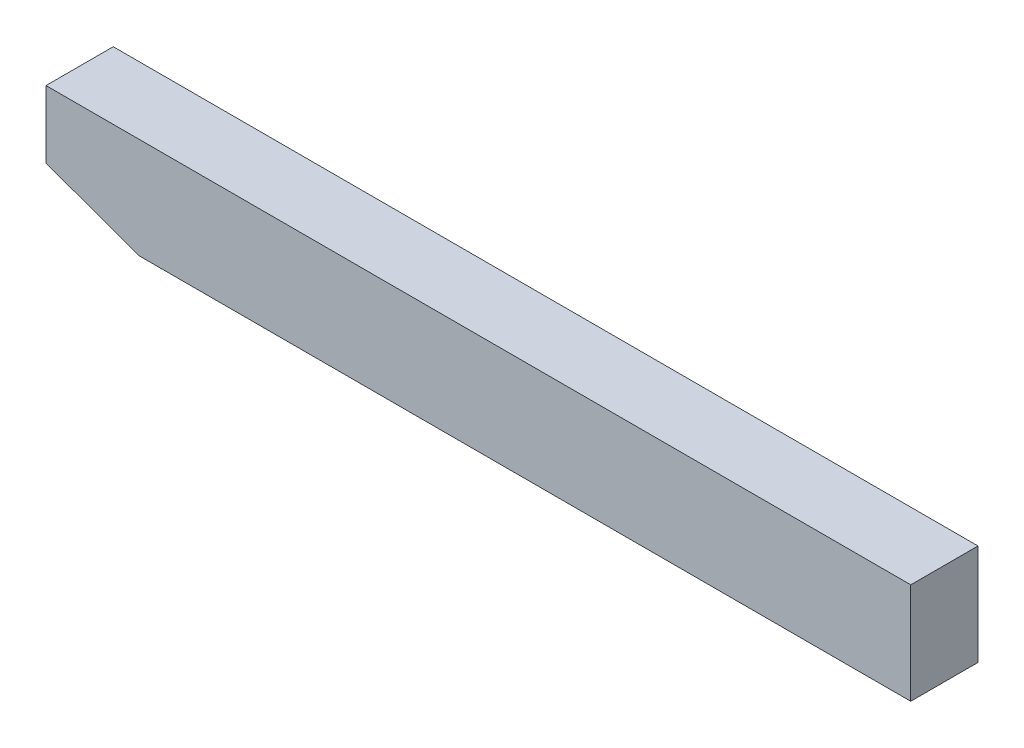
ISO-10303-21;
HEADER;
FILE_DESCRIPTION(('STEP AP214'),'2;1');
FILE_NAME('part.step','',(''),(''),'','','');
FILE_SCHEMA(('AUTOMOTIVE_DESIGN { 1 0 10303 214 1 1 1 1 }'));
ENDSEC;
DATA;
#1=APPLICATION_CONTEXT('core data for automotive mechanical design processes');
#2=APPLICATION_PROTOCOL_DEFINITION('international standard','automotive_design',2000,#1);
#3=PRODUCT_CONTEXT('',#1,'mechanical');
#4=PRODUCT('Part','Part','',(#3));
#5=PRODUCT_RELATED_PRODUCT_CATEGORY('part','',(#4));
#6=PRODUCT_DEFINITION_FORMATION('','',#4);
#7=PRODUCT_DEFINITION_CONTEXT('part definition',#1,'design');
#8=PRODUCT_DEFINITION('design','',#6,#7);
#9=PRODUCT_DEFINITION_SHAPE('','',#8);
#10=(LENGTH_UNIT() NAMED_UNIT(*) SI_UNIT(.MILLI.,.METRE.));
#11=(NAMED_UNIT(*) PLANE_ANGLE_UNIT() SI_UNIT($,.RADIAN.));
#12=(NAMED_UNIT(*) SI_UNIT($,.STERADIAN.) SOLID_ANGLE_UNIT());
#13=UNCERTAINTY_MEASURE_WITH_UNIT(LENGTH_MEASURE(1.E-05),#10,'distance_accuracy_value','');
#14=(GEOMETRIC_REPRESENTATION_CONTEXT(3) GLOBAL_UNCERTAINTY_ASSIGNED_CONTEXT((#13)) GLOBAL_UNIT_ASSIGNED_CONTEXT((#10,
#11,#12)) REPRESENTATION_CONTEXT('',''));
#15=CARTESIAN_POINT('',(0.,0.,0.));
#16=DIRECTION('',(0.,0.,1.));
#17=DIRECTION('',(1.,0.,0.));
#18=AXIS2_PLACEMENT_3D('',#15,#16,#17);
#19=CARTESIAN_POINT('',(326.5693928594,12.7,-12.7));
#20=DIRECTION('',(0.,0.,1.));
#21=DIRECTION('',(0.,-1.,0.));
#22=AXIS2_PLACEMENT_3D('',#19,#20,#21);
#23=PLANE('',#22);
#24=DIRECTION('',(-1.,0.,0.));
#25=VECTOR('',#24,1.);
#26=CARTESIAN_POINT('',(326.5693928594,-12.7,-12.7));
#27=LINE('',#26,#25);
#28=CARTESIAN_POINT('',(326.5693928594,-12.7,-12.7));
#29=VERTEX_POINT('',#28);
#30=CARTESIAN_POINT('',(35.2949340270433,-12.7,-12.7));
#31=VERTEX_POINT('',#30);
#32=EDGE_CURVE('E51',#29,#31,#27,.T.);
#33=ORIENTED_EDGE('',*,*,#32,.T.);
#34=DIRECTION('',(-0.940939875543587,0.338573700413986,0.));
#35=VECTOR('',#34,1.);
#36=CARTESIAN_POINT('',(0.,0.,-12.7));
#37=LINE('',#36,#35);
#38=CARTESIAN_POINT('',(0.,0.,-12.7));
#39=VERTEX_POINT('',#38);
#40=EDGE_CURVE('E122',#31,#39,#37,.T.);
#41=ORIENTED_EDGE('',*,*,#40,.T.);
#42=DIRECTION('',(0.,1.,0.));
#43=VECTOR('',#42,1.);
#44=CARTESIAN_POINT('',(0.,12.7,-12.7));
#45=LINE('',#44,#43);
#46=CARTESIAN_POINT('',(0.,25.4,-12.7));
#47=VERTEX_POINT('',#46);
#48=EDGE_CURVE('E136',#39,#47,#45,.T.);
#49=ORIENTED_EDGE('',*,*,#48,.T.);
#50=DIRECTION('',(1.,0.,0.));
#51=VECTOR('',#50,1.);
#52=CARTESIAN_POINT('',(326.5693928594,25.4,-12.7));
#53=LINE('',#52,#51);
#54=CARTESIAN_POINT('',(326.5693928594,25.4,-12.7));
#55=VERTEX_POINT('',#54);
#56=EDGE_CURVE('E118',#47,#55,#53,.T.);
#57=ORIENTED_EDGE('',*,*,#56,.T.);
#58=DIRECTION('',(0.,1.,0.));
#59=VECTOR('',#58,1.);
#60=CARTESIAN_POINT('',(326.5693928594,12.7,-12.7));
#61=LINE('',#60,#59);
#62=EDGE_CURVE('E97',#29,#55,#61,.T.);
#63=ORIENTED_EDGE('',*,*,#62,.F.);
#64=EDGE_LOOP('',(#33,#41,#49,#57,#63));
#65=FACE_BOUND('',#64,.T.);
#66=ADVANCED_FACE('F43',(#65),#23,.F.);
#67=CARTESIAN_POINT('',(326.5693928594,12.7,12.7));
#68=DIRECTION('',(0.,0.,-1.));
#69=DIRECTION('',(0.,1.,0.));
#70=AXIS2_PLACEMENT_3D('',#67,#68,#69);
#71=PLANE('',#70);
#72=DIRECTION('',(0.,-1.,0.));
#73=VECTOR('',#72,1.);
#74=CARTESIAN_POINT('',(0.,12.7,12.7));
#75=LINE('',#74,#73);
#76=CARTESIAN_POINT('',(0.,25.4,12.7));
#77=VERTEX_POINT('',#76);
#78=CARTESIAN_POINT('',(0.,0.,12.7));
#79=VERTEX_POINT('',#78);
#80=EDGE_CURVE('E140',#77,#79,#75,.T.);
#81=ORIENTED_EDGE('',*,*,#80,.T.);
#82=DIRECTION('',(0.940939875543587,-0.338573700413986,0.));
#83=VECTOR('',#82,1.);
#84=CARTESIAN_POINT('',(285.088106838636,-102.581830981084,12.7));
#85=LINE('',#84,#83);
#86=CARTESIAN_POINT('',(35.2949340270433,-12.7,12.7));
#87=VERTEX_POINT('',#86);
#88=EDGE_CURVE('E58',#79,#87,#85,.T.);
#89=ORIENTED_EDGE('',*,*,#88,.T.);
#90=DIRECTION('',(-1.,0.,0.));
#91=VECTOR('',#90,1.);
#92=CARTESIAN_POINT('',(326.5693928594,-12.7,12.7));
#93=LINE('',#92,#91);
#94=CARTESIAN_POINT('',(326.5693928594,-12.7,12.7));
#95=VERTEX_POINT('',#94);
#96=EDGE_CURVE('E11',#95,#87,#93,.T.);
#97=ORIENTED_EDGE('',*,*,#96,.F.);
#98=DIRECTION('',(0.,-1.,0.));
#99=VECTOR('',#98,1.);
#100=CARTESIAN_POINT('',(326.5693928594,12.7,12.7));
#101=LINE('',#100,#99);
#102=CARTESIAN_POINT('',(326.5693928594,25.4,12.7));
#103=VERTEX_POINT('',#102);
#104=EDGE_CURVE('E90',#103,#95,#101,.T.);
#105=ORIENTED_EDGE('',*,*,#104,.F.);
#106=DIRECTION('',(-1.,0.,0.));
#107=VECTOR('',#106,1.);
#108=CARTESIAN_POINT('',(326.5693928594,25.4,12.7));
#109=LINE('',#108,#107);
#110=EDGE_CURVE('E95',#103,#77,#109,.T.);
#111=ORIENTED_EDGE('',*,*,#110,.T.);
#112=EDGE_LOOP('',(#81,#89,#97,#105,#111));
#113=FACE_BOUND('',#112,.T.);
#114=ADVANCED_FACE('F93',(#113),#71,.F.);
#115=CARTESIAN_POINT('',(326.5693928594,-12.7,12.7));
#116=DIRECTION('',(0.,1.,0.));
#117=DIRECTION('',(0.,0.,1.));
#118=AXIS2_PLACEMENT_3D('',#115,#116,#117);
#119=PLANE('',#118);
#120=ORIENTED_EDGE('',*,*,#96,.T.);
#121=DIRECTION('',(0.,0.,1.));
#122=VECTOR('',#121,1.);
#123=CARTESIAN_POINT('',(35.2949340270433,-12.7,-12.7));
#124=LINE('',#123,#122);
#125=EDGE_CURVE('E126',#31,#87,#124,.T.);
#126=ORIENTED_EDGE('',*,*,#125,.F.);
#127=ORIENTED_EDGE('',*,*,#32,.F.);
#128=DIRECTION('',(0.,0.,-1.));
#129=VECTOR('',#128,1.);
#130=CARTESIAN_POINT('',(326.5693928594,-12.7,12.7));
#131=LINE('',#130,#129);
#132=EDGE_CURVE('E66',#95,#29,#131,.T.);
#133=ORIENTED_EDGE('',*,*,#132,.F.);
#134=EDGE_LOOP('',(#120,#126,#127,#133));
#135=FACE_BOUND('',#134,.T.);
#136=ADVANCED_FACE('F157',(#135),#119,.F.);
#137=CARTESIAN_POINT('',(326.5693928594,0.,0.));
#138=DIRECTION('',(1.,0.,0.));
#139=DIRECTION('',(0.,0.,-1.));
#140=AXIS2_PLACEMENT_3D('',#137,#138,#139);
#141=PLANE('',#140);
#142=ORIENTED_EDGE('',*,*,#62,.T.);
#143=DIRECTION('',(0.,0.,1.));
#144=VECTOR('',#143,1.);
#145=CARTESIAN_POINT('',(326.5693928594,25.4,-339.516245545654));
#146=LINE('',#145,#144);
#147=EDGE_CURVE('E100',#55,#103,#146,.T.);
#148=ORIENTED_EDGE('',*,*,#147,.T.);
#149=ORIENTED_EDGE('',*,*,#104,.T.);
#150=ORIENTED_EDGE('',*,*,#132,.T.);
#151=EDGE_LOOP('',(#142,#148,#149,#150));
#152=FACE_BOUND('',#151,.T.);
#153=ADVANCED_FACE('F101',(#152),#141,.T.);
#154=CARTESIAN_POINT('',(0.,0.,0.));
#155=DIRECTION('',(1.,0.,0.));
#156=DIRECTION('',(0.,0.,-1.));
#157=AXIS2_PLACEMENT_3D('',#154,#155,#156);
#158=PLANE('',#157);
#159=ORIENTED_EDGE('',*,*,#48,.F.);
#160=DIRECTION('',(0.,0.,1.));
#161=VECTOR('',#160,1.);
#162=CARTESIAN_POINT('',(0.,0.,-12.7));
#163=LINE('',#162,#161);
#164=EDGE_CURVE('E127',#39,#79,#163,.T.);
#165=ORIENTED_EDGE('',*,*,#164,.T.);
#166=ORIENTED_EDGE('',*,*,#80,.F.);
#167=DIRECTION('',(0.,0.,1.));
#168=VECTOR('',#167,1.);
#169=CARTESIAN_POINT('',(0.,25.4,-339.516245545654));
#170=LINE('',#169,#168);
#171=EDGE_CURVE('E107',#47,#77,#170,.T.);
#172=ORIENTED_EDGE('',*,*,#171,.F.);
#173=EDGE_LOOP('',(#159,#165,#166,#172));
#174=FACE_BOUND('',#173,.T.);
#175=ADVANCED_FACE('F160',(#174),#158,.F.);
#176=CARTESIAN_POINT('',(0.,0.,-12.7));
#177=DIRECTION('',(0.338573700413986,0.940939875543587,0.));
#178=DIRECTION('',(-0.940939875543587,0.338573700413986,0.));
#179=AXIS2_PLACEMENT_3D('',#176,#177,#178);
#180=PLANE('',#179);
#181=ORIENTED_EDGE('',*,*,#164,.F.);
#182=ORIENTED_EDGE('',*,*,#40,.F.);
#183=ORIENTED_EDGE('',*,*,#125,.T.);
#184=ORIENTED_EDGE('',*,*,#88,.F.);
#185=EDGE_LOOP('',(#181,#182,#183,#184));
#186=FACE_BOUND('',#185,.T.);
#187=ADVANCED_FACE('F158',(#186),#180,.F.);
#188=CARTESIAN_POINT('',(326.5693928594,25.4,-339.516245545654));
#189=DIRECTION('',(0.,1.,0.));
#190=DIRECTION('',(-1.,0.,0.));
#191=AXIS2_PLACEMENT_3D('',#188,#189,#190);
#192=PLANE('',#191);
#193=ORIENTED_EDGE('',*,*,#56,.F.);
#194=ORIENTED_EDGE('',*,*,#171,.T.);
#195=ORIENTED_EDGE('',*,*,#110,.F.);
#196=ORIENTED_EDGE('',*,*,#147,.F.);
#197=EDGE_LOOP('',(#193,#194,#195,#196));
#198=FACE_BOUND('',#197,.T.);
#199=ADVANCED_FACE('F110',(#198),#192,.T.);
#200=CLOSED_SHELL('',(#66,#114,#136,#153,#175,#187,#199));
#201=MANIFOLD_SOLID_BREP('B2',#200);
#202=ADVANCED_BREP_SHAPE_REPRESENTATION('',(#18,#201),#14);
#203=SHAPE_DEFINITION_REPRESENTATION(#9,#202);
ENDSEC;
END-ISO-10303-21;
